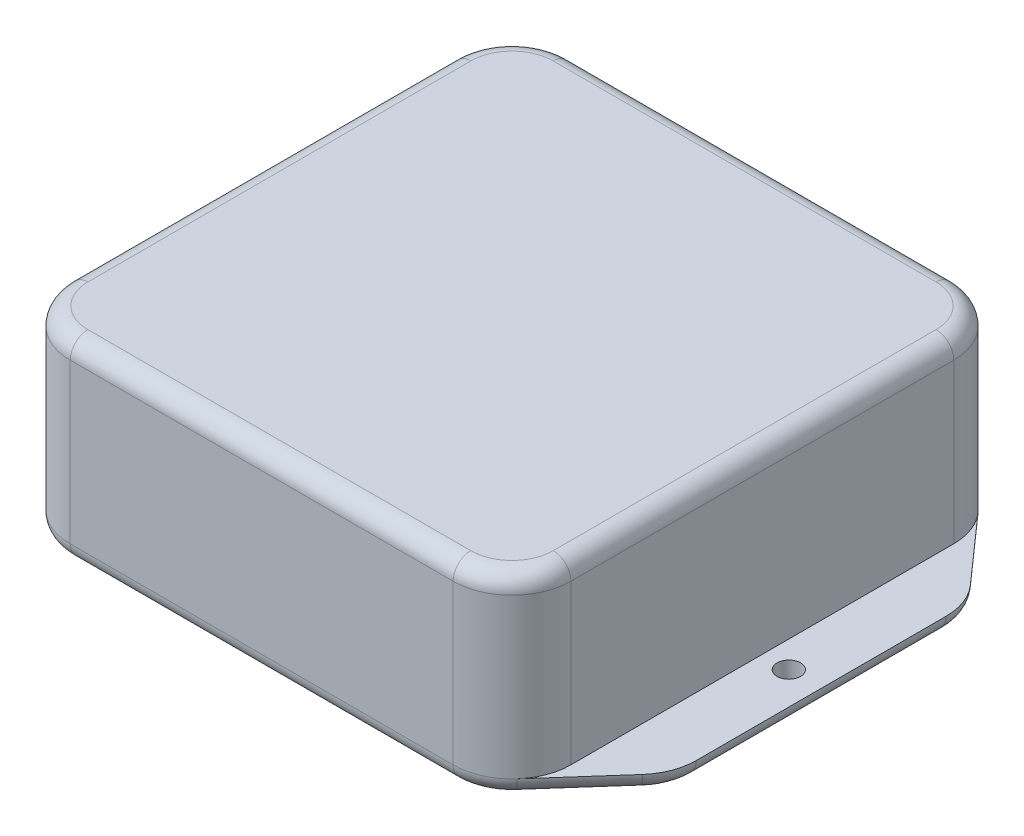
ISO-10303-21;
HEADER;
FILE_DESCRIPTION(('STEP AP214'),'2;1');
FILE_NAME('part.step','',(''),(''),'','','');
FILE_SCHEMA(('AUTOMOTIVE_DESIGN { 1 0 10303 214 1 1 1 1 }'));
ENDSEC;
DATA;
#1=APPLICATION_CONTEXT('core data for automotive mechanical design processes');
#2=APPLICATION_PROTOCOL_DEFINITION('international standard','automotive_design',2000,#1);
#3=PRODUCT_CONTEXT('',#1,'mechanical');
#4=PRODUCT('Part','Part','',(#3));
#5=PRODUCT_RELATED_PRODUCT_CATEGORY('part','',(#4));
#6=PRODUCT_DEFINITION_FORMATION('','',#4);
#7=PRODUCT_DEFINITION_CONTEXT('part definition',#1,'design');
#8=PRODUCT_DEFINITION('design','',#6,#7);
#9=PRODUCT_DEFINITION_SHAPE('','',#8);
#10=(LENGTH_UNIT() NAMED_UNIT(*) SI_UNIT(.MILLI.,.METRE.));
#11=(NAMED_UNIT(*) PLANE_ANGLE_UNIT() SI_UNIT($,.RADIAN.));
#12=(NAMED_UNIT(*) SI_UNIT($,.STERADIAN.) SOLID_ANGLE_UNIT());
#13=UNCERTAINTY_MEASURE_WITH_UNIT(LENGTH_MEASURE(1.E-05),#10,'distance_accuracy_value','');
#14=(GEOMETRIC_REPRESENTATION_CONTEXT(3) GLOBAL_UNCERTAINTY_ASSIGNED_CONTEXT((#13)) GLOBAL_UNIT_ASSIGNED_CONTEXT((#10,
#11,#12)) REPRESENTATION_CONTEXT('',''));
#15=CARTESIAN_POINT('',(0.,0.,0.));
#16=DIRECTION('',(0.,0.,1.));
#17=DIRECTION('',(1.,0.,0.));
#18=AXIS2_PLACEMENT_3D('',#15,#16,#17);
#19=CARTESIAN_POINT('',(32.5,30.,32.5));
#20=DIRECTION('',(0.,-1.,0.));
#21=DIRECTION('',(0.,0.,-1.));
#22=AXIS2_PLACEMENT_3D('',#19,#20,#21);
#23=CYLINDRICAL_SURFACE('',#22,10.);
#24=DIRECTION('',(0.,-1.,0.));
#25=VECTOR('',#24,1.);
#26=CARTESIAN_POINT('',(32.4999999999999,30.,42.5));
#27=LINE('',#26,#25);
#28=CARTESIAN_POINT('',(32.4999999999999,27.,42.5));
#29=VERTEX_POINT('',#28);
#30=CARTESIAN_POINT('',(32.4999999999999,0.,42.5));
#31=VERTEX_POINT('',#30);
#32=EDGE_CURVE('E217',#29,#31,#27,.T.);
#33=ORIENTED_EDGE('',*,*,#32,.T.);
#34=CARTESIAN_POINT('',(32.5,0.,32.5));
#35=DIRECTION('',(0.,-1.,0.));
#36=DIRECTION('',(0.,0.,-1.));
#37=AXIS2_PLACEMENT_3D('',#34,#35,#36);
#38=CIRCLE('',#37,10.);
#39=CARTESIAN_POINT('',(39.9862333295633,0.,39.1299555455022));
#40=VERTEX_POINT('',#39);
#41=EDGE_CURVE('E212',#31,#40,#38,.F.);
#42=ORIENTED_EDGE('',*,*,#41,.T.);
#43=CARTESIAN_POINT('',(32.5,0.,32.5));
#44=DIRECTION('',(0.,1.,0.));
#45=DIRECTION('',(0.,0.,1.));
#46=AXIS2_PLACEMENT_3D('',#43,#44,#45);
#47=CIRCLE('',#46,10.);
#48=CARTESIAN_POINT('',(42.5,0.,32.4999999999999));
#49=VERTEX_POINT('',#48);
#50=EDGE_CURVE('E215',#40,#49,#47,.T.);
#51=ORIENTED_EDGE('',*,*,#50,.T.);
#52=DIRECTION('',(0.,-1.,0.));
#53=VECTOR('',#52,1.);
#54=CARTESIAN_POINT('',(42.5,30.,32.4999999999999));
#55=LINE('',#54,#53);
#56=CARTESIAN_POINT('',(42.5,27.,32.4999999999999));
#57=VERTEX_POINT('',#56);
#58=EDGE_CURVE('E308',#57,#49,#55,.T.);
#59=ORIENTED_EDGE('',*,*,#58,.F.);
#60=CARTESIAN_POINT('',(32.5,27.,32.5));
#61=DIRECTION('',(0.,1.,0.));
#62=DIRECTION('',(0.,0.,1.));
#63=AXIS2_PLACEMENT_3D('',#60,#61,#62);
#64=CIRCLE('',#63,10.);
#65=EDGE_CURVE('E223',#57,#29,#64,.F.);
#66=ORIENTED_EDGE('',*,*,#65,.T.);
#67=EDGE_LOOP('',(#33,#42,#51,#59,#66));
#68=FACE_BOUND('',#67,.T.);
#69=ADVANCED_FACE('F37',(#68),#23,.T.);
#70=CARTESIAN_POINT('',(42.5,30.,32.4999999999999));
#71=DIRECTION('',(-1.,0.,0.));
#72=DIRECTION('',(0.,0.,1.));
#73=AXIS2_PLACEMENT_3D('',#70,#71,#72);
#74=PLANE('',#73);
#75=DIRECTION('',(0.,-1.,0.));
#76=VECTOR('',#75,1.);
#77=CARTESIAN_POINT('',(42.5,30.,-32.4999999999999));
#78=LINE('',#77,#76);
#79=CARTESIAN_POINT('',(42.5,27.,-32.4999999999999));
#80=VERTEX_POINT('',#79);
#81=CARTESIAN_POINT('',(42.5,0.,-32.4999999999999));
#82=VERTEX_POINT('',#81);
#83=EDGE_CURVE('E306',#80,#82,#78,.T.);
#84=ORIENTED_EDGE('',*,*,#83,.F.);
#85=DIRECTION('',(0.,0.,-1.));
#86=VECTOR('',#85,1.);
#87=CARTESIAN_POINT('',(42.5,27.,32.4999999999999));
#88=LINE('',#87,#86);
#89=EDGE_CURVE('E11',#80,#57,#88,.F.);
#90=ORIENTED_EDGE('',*,*,#89,.T.);
#91=ORIENTED_EDGE('',*,*,#58,.T.);
#92=DIRECTION('',(0.,0.,-1.));
#93=VECTOR('',#92,1.);
#94=CARTESIAN_POINT('',(42.5,0.,32.4999999999999));
#95=LINE('',#94,#93);
#96=EDGE_CURVE('E234',#49,#82,#95,.T.);
#97=ORIENTED_EDGE('',*,*,#96,.T.);
#98=EDGE_LOOP('',(#84,#90,#91,#97));
#99=FACE_BOUND('',#98,.T.);
#100=ADVANCED_FACE('F450',(#99),#74,.F.);
#101=CARTESIAN_POINT('',(32.5,30.,-32.5));
#102=DIRECTION('',(0.,-1.,0.));
#103=DIRECTION('',(0.,0.,-1.));
#104=AXIS2_PLACEMENT_3D('',#101,#102,#103);
#105=CYLINDRICAL_SURFACE('',#104,10.);
#106=CARTESIAN_POINT('',(32.5,0.,-32.5));
#107=DIRECTION('',(0.,1.,0.));
#108=DIRECTION('',(0.,0.,-1.));
#109=AXIS2_PLACEMENT_3D('',#106,#107,#108);
#110=CIRCLE('',#109,10.);
#111=CARTESIAN_POINT('',(39.9862333295633,0.,-39.1299555455022));
#112=VERTEX_POINT('',#111);
#113=EDGE_CURVE('E280',#82,#112,#110,.T.);
#114=ORIENTED_EDGE('',*,*,#113,.T.);
#115=CARTESIAN_POINT('',(32.5,0.,-32.5));
#116=DIRECTION('',(0.,-1.,0.));
#117=DIRECTION('',(0.,0.,-1.));
#118=AXIS2_PLACEMENT_3D('',#115,#116,#117);
#119=CIRCLE('',#118,10.);
#120=CARTESIAN_POINT('',(32.4999999999999,0.,-42.5));
#121=VERTEX_POINT('',#120);
#122=EDGE_CURVE('E344',#112,#121,#119,.F.);
#123=ORIENTED_EDGE('',*,*,#122,.T.);
#124=DIRECTION('',(0.,-1.,0.));
#125=VECTOR('',#124,1.);
#126=CARTESIAN_POINT('',(32.4999999999999,30.,-42.5));
#127=LINE('',#126,#125);
#128=CARTESIAN_POINT('',(32.4999999999999,27.,-42.5));
#129=VERTEX_POINT('',#128);
#130=EDGE_CURVE('E303',#129,#121,#127,.T.);
#131=ORIENTED_EDGE('',*,*,#130,.F.);
#132=CARTESIAN_POINT('',(32.5,27.,-32.5));
#133=DIRECTION('',(0.,1.,0.));
#134=DIRECTION('',(0.,0.,1.));
#135=AXIS2_PLACEMENT_3D('',#132,#133,#134);
#136=CIRCLE('',#135,10.);
#137=EDGE_CURVE('E342',#129,#80,#136,.F.);
#138=ORIENTED_EDGE('',*,*,#137,.T.);
#139=ORIENTED_EDGE('',*,*,#83,.T.);
#140=EDGE_LOOP('',(#114,#123,#131,#138,#139));
#141=FACE_BOUND('',#140,.T.);
#142=ADVANCED_FACE('F448',(#141),#105,.T.);
#143=CARTESIAN_POINT('',(-32.4999999999999,30.,-42.5));
#144=DIRECTION('',(0.,0.,1.));
#145=DIRECTION('',(1.,0.,0.));
#146=AXIS2_PLACEMENT_3D('',#143,#144,#145);
#147=PLANE('',#146);
#148=ORIENTED_EDGE('',*,*,#130,.T.);
#149=DIRECTION('',(1.,0.,0.));
#150=VECTOR('',#149,1.);
#151=CARTESIAN_POINT('',(-32.5,0.,-42.5));
#152=LINE('',#151,#150);
#153=CARTESIAN_POINT('',(-32.5,0.,-42.5));
#154=VERTEX_POINT('',#153);
#155=EDGE_CURVE('E348',#121,#154,#152,.F.);
#156=ORIENTED_EDGE('',*,*,#155,.T.);
#157=DIRECTION('',(0.,-1.,0.));
#158=VECTOR('',#157,1.);
#159=CARTESIAN_POINT('',(-32.5,30.,-42.5));
#160=LINE('',#159,#158);
#161=CARTESIAN_POINT('',(-32.5,27.,-42.5));
#162=VERTEX_POINT('',#161);
#163=EDGE_CURVE('E300',#162,#154,#160,.T.);
#164=ORIENTED_EDGE('',*,*,#163,.F.);
#165=DIRECTION('',(-1.,0.,0.));
#166=VECTOR('',#165,1.);
#167=CARTESIAN_POINT('',(32.4999999999999,27.,-42.5));
#168=LINE('',#167,#166);
#169=EDGE_CURVE('E346',#162,#129,#168,.F.);
#170=ORIENTED_EDGE('',*,*,#169,.T.);
#171=EDGE_LOOP('',(#148,#156,#164,#170));
#172=FACE_BOUND('',#171,.T.);
#173=ADVANCED_FACE('F790',(#172),#147,.F.);
#174=CARTESIAN_POINT('',(-32.5,30.,-32.5));
#175=DIRECTION('',(0.,-1.,0.));
#176=DIRECTION('',(0.,0.,-1.));
#177=AXIS2_PLACEMENT_3D('',#174,#175,#176);
#178=CYLINDRICAL_SURFACE('',#177,10.);
#179=ORIENTED_EDGE('',*,*,#163,.T.);
#180=CARTESIAN_POINT('',(-32.5,0.,-32.5));
#181=DIRECTION('',(0.,-1.,0.));
#182=DIRECTION('',(0.,0.,-1.));
#183=AXIS2_PLACEMENT_3D('',#180,#181,#182);
#184=CIRCLE('',#183,10.);
#185=CARTESIAN_POINT('',(-39.9862333295633,0.,-39.1299555455022));
#186=VERTEX_POINT('',#185);
#187=EDGE_CURVE('E352',#154,#186,#184,.F.);
#188=ORIENTED_EDGE('',*,*,#187,.T.);
#189=CARTESIAN_POINT('',(-32.5,0.,-32.5));
#190=DIRECTION('',(0.,1.,0.));
#191=DIRECTION('',(0.,0.,-1.));
#192=AXIS2_PLACEMENT_3D('',#189,#190,#191);
#193=CIRCLE('',#192,10.);
#194=CARTESIAN_POINT('',(-42.5,0.,-32.4999999999999));
#195=VERTEX_POINT('',#194);
#196=EDGE_CURVE('E283',#186,#195,#193,.T.);
#197=ORIENTED_EDGE('',*,*,#196,.T.);
#198=DIRECTION('',(0.,-1.,0.));
#199=VECTOR('',#198,1.);
#200=CARTESIAN_POINT('',(-42.5,30.,-32.4999999999999));
#201=LINE('',#200,#199);
#202=CARTESIAN_POINT('',(-42.5,27.,-32.4999999999999));
#203=VERTEX_POINT('',#202);
#204=EDGE_CURVE('E298',#203,#195,#201,.T.);
#205=ORIENTED_EDGE('',*,*,#204,.F.);
#206=CARTESIAN_POINT('',(-32.5,27.,-32.5));
#207=DIRECTION('',(0.,1.,0.));
#208=DIRECTION('',(0.,0.,1.));
#209=AXIS2_PLACEMENT_3D('',#206,#207,#208);
#210=CIRCLE('',#209,10.);
#211=EDGE_CURVE('E350',#203,#162,#210,.F.);
#212=ORIENTED_EDGE('',*,*,#211,.T.);
#213=EDGE_LOOP('',(#179,#188,#197,#205,#212));
#214=FACE_BOUND('',#213,.T.);
#215=ADVANCED_FACE('F484',(#214),#178,.T.);
#216=CARTESIAN_POINT('',(-42.5,30.,32.4999999999999));
#217=DIRECTION('',(1.,0.,0.));
#218=DIRECTION('',(0.,0.,-1.));
#219=AXIS2_PLACEMENT_3D('',#216,#217,#218);
#220=PLANE('',#219);
#221=DIRECTION('',(0.,-1.,0.));
#222=VECTOR('',#221,1.);
#223=CARTESIAN_POINT('',(-42.5,30.,32.4999999999999));
#224=LINE('',#223,#222);
#225=CARTESIAN_POINT('',(-42.5,27.,32.4999999999999));
#226=VERTEX_POINT('',#225);
#227=CARTESIAN_POINT('',(-42.5,0.,32.4999999999999));
#228=VERTEX_POINT('',#227);
#229=EDGE_CURVE('E296',#226,#228,#224,.T.);
#230=ORIENTED_EDGE('',*,*,#229,.F.);
#231=DIRECTION('',(0.,0.,1.));
#232=VECTOR('',#231,1.);
#233=CARTESIAN_POINT('',(-42.5,27.,-32.4999999999999));
#234=LINE('',#233,#232);
#235=EDGE_CURVE('E46',#226,#203,#234,.F.);
#236=ORIENTED_EDGE('',*,*,#235,.T.);
#237=ORIENTED_EDGE('',*,*,#204,.T.);
#238=DIRECTION('',(0.,0.,1.));
#239=VECTOR('',#238,1.);
#240=CARTESIAN_POINT('',(-42.5,0.,32.4999999999999));
#241=LINE('',#240,#239);
#242=EDGE_CURVE('E286',#195,#228,#241,.T.);
#243=ORIENTED_EDGE('',*,*,#242,.T.);
#244=EDGE_LOOP('',(#230,#236,#237,#243));
#245=FACE_BOUND('',#244,.T.);
#246=ADVANCED_FACE('F480',(#245),#220,.F.);
#247=CARTESIAN_POINT('',(-32.5,30.,32.5));
#248=DIRECTION('',(0.,-1.,0.));
#249=DIRECTION('',(0.,0.,-1.));
#250=AXIS2_PLACEMENT_3D('',#247,#248,#249);
#251=CYLINDRICAL_SURFACE('',#250,10.);
#252=CARTESIAN_POINT('',(-32.5,0.,32.5));
#253=DIRECTION('',(0.,1.,0.));
#254=DIRECTION('',(0.,0.,-1.));
#255=AXIS2_PLACEMENT_3D('',#252,#253,#254);
#256=CIRCLE('',#255,10.);
#257=CARTESIAN_POINT('',(-39.9862333295633,0.,39.1299555455022));
#258=VERTEX_POINT('',#257);
#259=EDGE_CURVE('E289',#228,#258,#256,.T.);
#260=ORIENTED_EDGE('',*,*,#259,.T.);
#261=CARTESIAN_POINT('',(-32.5,0.,32.5));
#262=DIRECTION('',(0.,-1.,0.));
#263=DIRECTION('',(0.,0.,-1.));
#264=AXIS2_PLACEMENT_3D('',#261,#262,#263);
#265=CIRCLE('',#264,10.);
#266=CARTESIAN_POINT('',(-32.4999999999999,0.,42.5));
#267=VERTEX_POINT('',#266);
#268=EDGE_CURVE('E357',#258,#267,#265,.F.);
#269=ORIENTED_EDGE('',*,*,#268,.T.);
#270=DIRECTION('',(0.,-1.,0.));
#271=VECTOR('',#270,1.);
#272=CARTESIAN_POINT('',(-32.4999999999999,30.,42.5));
#273=LINE('',#272,#271);
#274=CARTESIAN_POINT('',(-32.4999999999999,27.,42.5));
#275=VERTEX_POINT('',#274);
#276=EDGE_CURVE('E293',#275,#267,#273,.T.);
#277=ORIENTED_EDGE('',*,*,#276,.F.);
#278=CARTESIAN_POINT('',(-32.5,27.,32.5));
#279=DIRECTION('',(0.,1.,0.));
#280=DIRECTION('',(0.,0.,1.));
#281=AXIS2_PLACEMENT_3D('',#278,#279,#280);
#282=CIRCLE('',#281,10.);
#283=EDGE_CURVE('E354',#275,#226,#282,.F.);
#284=ORIENTED_EDGE('',*,*,#283,.T.);
#285=ORIENTED_EDGE('',*,*,#229,.T.);
#286=EDGE_LOOP('',(#260,#269,#277,#284,#285));
#287=FACE_BOUND('',#286,.T.);
#288=ADVANCED_FACE('F469',(#287),#251,.T.);
#289=CARTESIAN_POINT('',(-32.4999999999999,30.,42.5));
#290=DIRECTION('',(0.,0.,-1.));
#291=DIRECTION('',(-1.,0.,0.));
#292=AXIS2_PLACEMENT_3D('',#289,#290,#291);
#293=PLANE('',#292);
#294=ORIENTED_EDGE('',*,*,#276,.T.);
#295=DIRECTION('',(-1.,0.,0.));
#296=VECTOR('',#295,1.);
#297=CARTESIAN_POINT('',(32.4999999999999,0.,42.5));
#298=LINE('',#297,#296);
#299=EDGE_CURVE('E361',#267,#31,#298,.F.);
#300=ORIENTED_EDGE('',*,*,#299,.T.);
#301=ORIENTED_EDGE('',*,*,#32,.F.);
#302=DIRECTION('',(1.,0.,0.));
#303=VECTOR('',#302,1.);
#304=CARTESIAN_POINT('',(-32.4999999999999,27.,42.5));
#305=LINE('',#304,#303);
#306=EDGE_CURVE('E359',#29,#275,#305,.F.);
#307=ORIENTED_EDGE('',*,*,#306,.T.);
#308=EDGE_LOOP('',(#294,#300,#301,#307));
#309=FACE_BOUND('',#308,.T.);
#310=ADVANCED_FACE('F465',(#309),#293,.F.);
#311=CARTESIAN_POINT('',(32.5,30.,32.5));
#312=DIRECTION('',(0.,1.,0.));
#313=DIRECTION('',(0.,0.,1.));
#314=AXIS2_PLACEMENT_3D('',#311,#312,#313);
#315=PLANE('',#314);
#316=DIRECTION('',(0.,0.,1.));
#317=VECTOR('',#316,1.);
#318=CARTESIAN_POINT('',(-39.5,30.,32.4999999999999));
#319=LINE('',#318,#317);
#320=CARTESIAN_POINT('',(-39.5,30.,-32.4999999999999));
#321=VERTEX_POINT('',#320);
#322=CARTESIAN_POINT('',(-39.5,30.,32.5));
#323=VERTEX_POINT('',#322);
#324=EDGE_CURVE('E54',#321,#323,#319,.T.);
#325=ORIENTED_EDGE('',*,*,#324,.T.);
#326=CARTESIAN_POINT('',(-32.5,30.,32.5));
#327=DIRECTION('',(0.,1.,0.));
#328=DIRECTION('',(0.,0.,1.));
#329=AXIS2_PLACEMENT_3D('',#326,#327,#328);
#330=CIRCLE('',#329,7.);
#331=CARTESIAN_POINT('',(-32.5,30.,39.5));
#332=VERTEX_POINT('',#331);
#333=EDGE_CURVE('E375',#323,#332,#330,.T.);
#334=ORIENTED_EDGE('',*,*,#333,.T.);
#335=DIRECTION('',(1.,0.,0.));
#336=VECTOR('',#335,1.);
#337=CARTESIAN_POINT('',(32.4999999999999,30.,39.5));
#338=LINE('',#337,#336);
#339=CARTESIAN_POINT('',(32.4999999999999,30.,39.5));
#340=VERTEX_POINT('',#339);
#341=EDGE_CURVE('E222',#332,#340,#338,.T.);
#342=ORIENTED_EDGE('',*,*,#341,.T.);
#343=CARTESIAN_POINT('',(32.5,30.,32.5));
#344=DIRECTION('',(0.,1.,0.));
#345=DIRECTION('',(0.,0.,1.));
#346=AXIS2_PLACEMENT_3D('',#343,#344,#345);
#347=CIRCLE('',#346,7.);
#348=CARTESIAN_POINT('',(39.5,30.,32.4999999999999));
#349=VERTEX_POINT('',#348);
#350=EDGE_CURVE('E365',#340,#349,#347,.T.);
#351=ORIENTED_EDGE('',*,*,#350,.T.);
#352=DIRECTION('',(0.,0.,-1.));
#353=VECTOR('',#352,1.);
#354=CARTESIAN_POINT('',(39.5,30.,-32.4999999999999));
#355=LINE('',#354,#353);
#356=CARTESIAN_POINT('',(39.5,30.,-32.4999999999999));
#357=VERTEX_POINT('',#356);
#358=EDGE_CURVE('E367',#349,#357,#355,.T.);
#359=ORIENTED_EDGE('',*,*,#358,.T.);
#360=CARTESIAN_POINT('',(32.5,30.,-32.5));
#361=DIRECTION('',(0.,1.,0.));
#362=DIRECTION('',(0.,0.,1.));
#363=AXIS2_PLACEMENT_3D('',#360,#361,#362);
#364=CIRCLE('',#363,7.);
#365=CARTESIAN_POINT('',(32.4999999999999,30.,-39.5));
#366=VERTEX_POINT('',#365);
#367=EDGE_CURVE('E369',#357,#366,#364,.T.);
#368=ORIENTED_EDGE('',*,*,#367,.T.);
#369=DIRECTION('',(-1.,0.,0.));
#370=VECTOR('',#369,1.);
#371=CARTESIAN_POINT('',(-32.5,30.,-39.5));
#372=LINE('',#371,#370);
#373=CARTESIAN_POINT('',(-32.5,30.,-39.5));
#374=VERTEX_POINT('',#373);
#375=EDGE_CURVE('E371',#366,#374,#372,.T.);
#376=ORIENTED_EDGE('',*,*,#375,.T.);
#377=CARTESIAN_POINT('',(-32.5,30.,-32.5));
#378=DIRECTION('',(0.,1.,0.));
#379=DIRECTION('',(0.,0.,1.));
#380=AXIS2_PLACEMENT_3D('',#377,#378,#379);
#381=CIRCLE('',#380,7.);
#382=EDGE_CURVE('E59',#374,#321,#381,.T.);
#383=ORIENTED_EDGE('',*,*,#382,.T.);
#384=EDGE_LOOP('',(#325,#334,#342,#351,#359,#368,#376,#383));
#385=FACE_BOUND('',#384,.T.);
#386=ADVANCED_FACE('F756',(#385),#315,.T.);
#387=CARTESIAN_POINT('',(0.,0.,0.));
#388=DIRECTION('',(0.,-1.,0.));
#389=DIRECTION('',(0.,0.,-1.));
#390=AXIS2_PLACEMENT_3D('',#387,#388,#389);
#391=PLANE('',#390);
#392=CARTESIAN_POINT('',(-47.,0.,0.));
#393=DIRECTION('',(0.,1.,0.));
#394=DIRECTION('',(0.,0.,1.));
#395=AXIS2_PLACEMENT_3D('',#392,#393,#394);
#396=CIRCLE('',#395,2.);
#397=CARTESIAN_POINT('',(-47.,0.,2.));
#398=VERTEX_POINT('',#397);
#399=EDGE_CURVE('E943',#398,#398,#396,.T.);
#400=ORIENTED_EDGE('',*,*,#399,.F.);
#401=EDGE_LOOP('',(#400));
#402=FACE_BOUND('',#401,.T.);
#403=ORIENTED_EDGE('',*,*,#259,.F.);
#404=ORIENTED_EDGE('',*,*,#242,.F.);
#405=ORIENTED_EDGE('',*,*,#196,.F.);
#406=DIRECTION('',(0.66299555455022,0.,-0.748623332956332));
#407=VECTOR('',#406,1.);
#408=CARTESIAN_POINT('',(-41.8312855135144,0.,-37.0466095774213));
#409=LINE('',#408,#407);
#410=CARTESIAN_POINT('',(-49.9862333295634,0.,-27.8384268494432));
#411=VERTEX_POINT('',#410);
#412=EDGE_CURVE('E269',#411,#186,#409,.T.);
#413=ORIENTED_EDGE('',*,*,#412,.F.);
#414=CARTESIAN_POINT('',(-42.5,0.,-21.208471303941));
#415=DIRECTION('',(0.,-1.,0.));
#416=DIRECTION('',(0.,0.,-1.));
#417=AXIS2_PLACEMENT_3D('',#414,#415,#416);
#418=CIRCLE('',#417,10.);
#419=CARTESIAN_POINT('',(-52.5,0.,-21.208471303941));
#420=VERTEX_POINT('',#419);
#421=EDGE_CURVE('E266',#420,#411,#418,.T.);
#422=ORIENTED_EDGE('',*,*,#421,.F.);
#423=DIRECTION('',(0.,0.,-1.));
#424=VECTOR('',#423,1.);
#425=CARTESIAN_POINT('',(-52.5,0.,0.));
#426=LINE('',#425,#424);
#427=CARTESIAN_POINT('',(-52.5,0.,21.208471303941));
#428=VERTEX_POINT('',#427);
#429=EDGE_CURVE('E263',#428,#420,#426,.T.);
#430=ORIENTED_EDGE('',*,*,#429,.F.);
#431=CARTESIAN_POINT('',(-42.5,0.,21.208471303941));
#432=DIRECTION('',(0.,-1.,0.));
#433=DIRECTION('',(0.,0.,-1.));
#434=AXIS2_PLACEMENT_3D('',#431,#432,#433);
#435=CIRCLE('',#434,10.);
#436=CARTESIAN_POINT('',(-49.9862333295633,0.,27.8384268494432));
#437=VERTEX_POINT('',#436);
#438=EDGE_CURVE('E253',#428,#437,#435,.F.);
#439=ORIENTED_EDGE('',*,*,#438,.T.);
#440=DIRECTION('',(0.662995554550219,0.,0.748623332956333));
#441=VECTOR('',#440,1.);
#442=CARTESIAN_POINT('',(-41.8312855135144,0.,37.0466095774212));
#443=LINE('',#442,#441);
#444=EDGE_CURVE('E250',#437,#258,#443,.T.);
#445=ORIENTED_EDGE('',*,*,#444,.T.);
#446=EDGE_LOOP('',(#403,#404,#405,#413,#422,#430,#439,#445));
#447=FACE_BOUND('',#446,.T.);
#448=ADVANCED_FACE('F737',(#402,#447),#391,.F.);
#449=CARTESIAN_POINT('',(0.,-3.,0.));
#450=DIRECTION('',(0.,-1.,0.));
#451=DIRECTION('',(0.,0.,-1.));
#452=AXIS2_PLACEMENT_3D('',#449,#450,#451);
#453=PLANE('',#452);
#454=CARTESIAN_POINT('',(-47.,-3.,0.));
#455=DIRECTION('',(0.,1.,0.));
#456=DIRECTION('',(0.,0.,1.));
#457=AXIS2_PLACEMENT_3D('',#454,#455,#456);
#458=CIRCLE('',#457,2.);
#459=CARTESIAN_POINT('',(-47.,-3.,2.));
#460=VERTEX_POINT('',#459);
#461=EDGE_CURVE('E416',#460,#460,#458,.T.);
#462=ORIENTED_EDGE('',*,*,#461,.T.);
#463=EDGE_LOOP('',(#462));
#464=FACE_BOUND('',#463,.T.);
#465=CARTESIAN_POINT('',(47.,-3.,0.));
#466=DIRECTION('',(0.,1.,0.));
#467=DIRECTION('',(0.,0.,-1.));
#468=AXIS2_PLACEMENT_3D('',#465,#466,#467);
#469=CIRCLE('',#468,2.);
#470=CARTESIAN_POINT('',(47.,-3.,-2.));
#471=VERTEX_POINT('',#470);
#472=EDGE_CURVE('E945',#471,#471,#469,.T.);
#473=ORIENTED_EDGE('',*,*,#472,.T.);
#474=EDGE_LOOP('',(#473));
#475=FACE_BOUND('',#474,.T.);
#476=DIRECTION('',(0.,0.,-1.));
#477=VECTOR('',#476,1.);
#478=CARTESIAN_POINT('',(49.5,-3.,0.));
#479=LINE('',#478,#477);
#480=CARTESIAN_POINT('',(49.5,-3.,-21.208471303941));
#481=VERTEX_POINT('',#480);
#482=CARTESIAN_POINT('',(49.5,-3.,21.208471303941));
#483=VERTEX_POINT('',#482);
#484=EDGE_CURVE('E337',#481,#483,#479,.F.);
#485=ORIENTED_EDGE('',*,*,#484,.T.);
#486=CARTESIAN_POINT('',(42.5,-3.,21.208471303941));
#487=DIRECTION('',(0.,-1.,0.));
#488=DIRECTION('',(0.,0.,-1.));
#489=AXIS2_PLACEMENT_3D('',#486,#487,#488);
#490=CIRCLE('',#489,7.);
#491=CARTESIAN_POINT('',(47.7403633306944,-3.,25.8494401857926));
#492=VERTEX_POINT('',#491);
#493=EDGE_CURVE('E339',#483,#492,#490,.T.);
#494=ORIENTED_EDGE('',*,*,#493,.T.);
#495=DIRECTION('',(-0.662995554550219,0.,0.748623332956333));
#496=VECTOR('',#495,1.);
#497=CARTESIAN_POINT('',(37.7403633306943,-3.,37.1409688818516));
#498=LINE('',#497,#496);
#499=CARTESIAN_POINT('',(37.7403633306943,-3.,37.1409688818516));
#500=VERTEX_POINT('',#499);
#501=EDGE_CURVE('E310',#492,#500,#498,.T.);
#502=ORIENTED_EDGE('',*,*,#501,.T.);
#503=CARTESIAN_POINT('',(32.5,-3.,32.5));
#504=DIRECTION('',(0.,-1.,0.));
#505=DIRECTION('',(0.,0.,-1.));
#506=AXIS2_PLACEMENT_3D('',#503,#504,#505);
#507=CIRCLE('',#506,7.);
#508=CARTESIAN_POINT('',(32.4999999999999,-3.,39.5));
#509=VERTEX_POINT('',#508);
#510=EDGE_CURVE('E241',#500,#509,#507,.T.);
#511=ORIENTED_EDGE('',*,*,#510,.T.);
#512=DIRECTION('',(-1.,0.,0.));
#513=VECTOR('',#512,1.);
#514=CARTESIAN_POINT('',(-32.4999999999999,-3.,39.5));
#515=LINE('',#514,#513);
#516=CARTESIAN_POINT('',(-32.5,-3.,39.5));
#517=VERTEX_POINT('',#516);
#518=EDGE_CURVE('E313',#509,#517,#515,.T.);
#519=ORIENTED_EDGE('',*,*,#518,.T.);
#520=CARTESIAN_POINT('',(-32.5,-3.,32.5));
#521=DIRECTION('',(0.,-1.,0.));
#522=DIRECTION('',(0.,0.,-1.));
#523=AXIS2_PLACEMENT_3D('',#520,#521,#522);
#524=CIRCLE('',#523,7.);
#525=CARTESIAN_POINT('',(-37.7403633306943,-3.,37.1409688818515));
#526=VERTEX_POINT('',#525);
#527=EDGE_CURVE('E315',#517,#526,#524,.T.);
#528=ORIENTED_EDGE('',*,*,#527,.T.);
#529=DIRECTION('',(0.662995554550219,0.,0.748623332956333));
#530=VECTOR('',#529,1.);
#531=CARTESIAN_POINT('',(-39.5854155146454,-3.,35.0576229137705));
#532=LINE('',#531,#530);
#533=CARTESIAN_POINT('',(-47.7403633306943,-3.,25.8494401857926));
#534=VERTEX_POINT('',#533);
#535=EDGE_CURVE('E317',#526,#534,#532,.F.);
#536=ORIENTED_EDGE('',*,*,#535,.T.);
#537=CARTESIAN_POINT('',(-42.5,-3.,21.208471303941));
#538=DIRECTION('',(0.,-1.,0.));
#539=DIRECTION('',(0.,0.,-1.));
#540=AXIS2_PLACEMENT_3D('',#537,#538,#539);
#541=CIRCLE('',#540,7.);
#542=CARTESIAN_POINT('',(-49.5,-3.,21.208471303941));
#543=VERTEX_POINT('',#542);
#544=EDGE_CURVE('E319',#534,#543,#541,.T.);
#545=ORIENTED_EDGE('',*,*,#544,.T.);
#546=DIRECTION('',(0.,0.,-1.));
#547=VECTOR('',#546,1.);
#548=CARTESIAN_POINT('',(-49.5,-3.,-21.208471303941));
#549=LINE('',#548,#547);
#550=CARTESIAN_POINT('',(-49.5,-3.,-21.208471303941));
#551=VERTEX_POINT('',#550);
#552=EDGE_CURVE('E321',#543,#551,#549,.T.);
#553=ORIENTED_EDGE('',*,*,#552,.T.);
#554=CARTESIAN_POINT('',(-42.5,-3.,-21.208471303941));
#555=DIRECTION('',(0.,-1.,0.));
#556=DIRECTION('',(0.,0.,-1.));
#557=AXIS2_PLACEMENT_3D('',#554,#555,#556);
#558=CIRCLE('',#557,7.00000000000001);
#559=CARTESIAN_POINT('',(-47.7403633306944,-3.,-25.8494401857926));
#560=VERTEX_POINT('',#559);
#561=EDGE_CURVE('E323',#551,#560,#558,.T.);
#562=ORIENTED_EDGE('',*,*,#561,.T.);
#563=DIRECTION('',(0.66299555455022,0.,-0.748623332956332));
#564=VECTOR('',#563,1.);
#565=CARTESIAN_POINT('',(-37.7403633306943,-3.,-37.1409688818515));
#566=LINE('',#565,#564);
#567=CARTESIAN_POINT('',(-37.7403633306943,-3.,-37.1409688818515));
#568=VERTEX_POINT('',#567);
#569=EDGE_CURVE('E325',#560,#568,#566,.T.);
#570=ORIENTED_EDGE('',*,*,#569,.T.);
#571=CARTESIAN_POINT('',(-32.5,-3.,-32.5));
#572=DIRECTION('',(0.,-1.,0.));
#573=DIRECTION('',(0.,0.,-1.));
#574=AXIS2_PLACEMENT_3D('',#571,#572,#573);
#575=CIRCLE('',#574,7.);
#576=CARTESIAN_POINT('',(-32.5,-3.,-39.5));
#577=VERTEX_POINT('',#576);
#578=EDGE_CURVE('E327',#568,#577,#575,.T.);
#579=ORIENTED_EDGE('',*,*,#578,.T.);
#580=DIRECTION('',(1.,0.,0.));
#581=VECTOR('',#580,1.);
#582=CARTESIAN_POINT('',(32.5,-3.,-39.5));
#583=LINE('',#582,#581);
#584=CARTESIAN_POINT('',(32.4999999999999,-3.,-39.5));
#585=VERTEX_POINT('',#584);
#586=EDGE_CURVE('E329',#577,#585,#583,.T.);
#587=ORIENTED_EDGE('',*,*,#586,.T.);
#588=CARTESIAN_POINT('',(32.5,-3.,-32.5));
#589=DIRECTION('',(0.,-1.,0.));
#590=DIRECTION('',(0.,0.,-1.));
#591=AXIS2_PLACEMENT_3D('',#588,#589,#590);
#592=CIRCLE('',#591,7.);
#593=CARTESIAN_POINT('',(37.7403633306943,-3.,-37.1409688818515));
#594=VERTEX_POINT('',#593);
#595=EDGE_CURVE('E331',#585,#594,#592,.T.);
#596=ORIENTED_EDGE('',*,*,#595,.T.);
#597=DIRECTION('',(-0.66299555455022,0.,-0.748623332956332));
#598=VECTOR('',#597,1.);
#599=CARTESIAN_POINT('',(39.5854155146454,-3.,-35.0576229137706));
#600=LINE('',#599,#598);
#601=CARTESIAN_POINT('',(47.7403633306944,-3.,-25.8494401857926));
#602=VERTEX_POINT('',#601);
#603=EDGE_CURVE('E333',#594,#602,#600,.F.);
#604=ORIENTED_EDGE('',*,*,#603,.T.);
#605=CARTESIAN_POINT('',(42.5,-3.,-21.208471303941));
#606=DIRECTION('',(0.,-1.,0.));
#607=DIRECTION('',(0.,0.,-1.));
#608=AXIS2_PLACEMENT_3D('',#605,#606,#607);
#609=CIRCLE('',#608,7.00000000000001);
#610=EDGE_CURVE('E335',#602,#481,#609,.T.);
#611=ORIENTED_EDGE('',*,*,#610,.T.);
#612=EDGE_LOOP('',(#485,#494,#502,#511,#519,#528,#536,#545,#553,#562,#570,#579,#587,#596,#604,#611));
#613=FACE_BOUND('',#612,.T.);
#614=ADVANCED_FACE('F734',(#464,#475,#613),#453,.T.);
#615=CARTESIAN_POINT('',(47.,0.,0.));
#616=DIRECTION('',(0.,1.,0.));
#617=DIRECTION('',(0.,0.,-1.));
#618=AXIS2_PLACEMENT_3D('',#615,#616,#617);
#619=CIRCLE('',#618,2.);
#620=CARTESIAN_POINT('',(47.,0.,-2.));
#621=VERTEX_POINT('',#620);
#622=EDGE_CURVE('E259',#621,#621,#619,.T.);
#623=ORIENTED_EDGE('',*,*,#622,.F.);
#624=EDGE_LOOP('',(#623));
#625=FACE_BOUND('',#624,.T.);
#626=ORIENTED_EDGE('',*,*,#50,.F.);
#627=DIRECTION('',(-0.662995554550219,0.,0.748623332956333));
#628=VECTOR('',#627,1.);
#629=CARTESIAN_POINT('',(41.8312855135144,0.,37.0466095774212));
#630=LINE('',#629,#628);
#631=CARTESIAN_POINT('',(49.9862333295633,0.,27.8384268494432));
#632=VERTEX_POINT('',#631);
#633=EDGE_CURVE('E230',#632,#40,#630,.T.);
#634=ORIENTED_EDGE('',*,*,#633,.F.);
#635=CARTESIAN_POINT('',(42.5,0.,21.208471303941));
#636=DIRECTION('',(0.,-1.,0.));
#637=DIRECTION('',(0.,0.,-1.));
#638=AXIS2_PLACEMENT_3D('',#635,#636,#637);
#639=CIRCLE('',#638,10.);
#640=CARTESIAN_POINT('',(52.5,0.,21.208471303941));
#641=VERTEX_POINT('',#640);
#642=EDGE_CURVE('E235',#641,#632,#639,.T.);
#643=ORIENTED_EDGE('',*,*,#642,.F.);
#644=DIRECTION('',(0.,0.,-1.));
#645=VECTOR('',#644,1.);
#646=CARTESIAN_POINT('',(52.5,0.,0.));
#647=LINE('',#646,#645);
#648=CARTESIAN_POINT('',(52.5,0.,-21.208471303941));
#649=VERTEX_POINT('',#648);
#650=EDGE_CURVE('E276',#641,#649,#647,.T.);
#651=ORIENTED_EDGE('',*,*,#650,.T.);
#652=CARTESIAN_POINT('',(42.5,0.,-21.208471303941));
#653=DIRECTION('',(0.,-1.,0.));
#654=DIRECTION('',(0.,0.,-1.));
#655=AXIS2_PLACEMENT_3D('',#652,#653,#654);
#656=CIRCLE('',#655,10.);
#657=CARTESIAN_POINT('',(49.9862333295634,0.,-27.8384268494432));
#658=VERTEX_POINT('',#657);
#659=EDGE_CURVE('E274',#649,#658,#656,.F.);
#660=ORIENTED_EDGE('',*,*,#659,.T.);
#661=DIRECTION('',(-0.66299555455022,0.,-0.748623332956332));
#662=VECTOR('',#661,1.);
#663=CARTESIAN_POINT('',(41.8312855135144,0.,-37.0466095774213));
#664=LINE('',#663,#662);
#665=EDGE_CURVE('E272',#658,#112,#664,.T.);
#666=ORIENTED_EDGE('',*,*,#665,.T.);
#667=ORIENTED_EDGE('',*,*,#113,.F.);
#668=ORIENTED_EDGE('',*,*,#96,.F.);
#669=EDGE_LOOP('',(#626,#634,#643,#651,#660,#666,#667,#668));
#670=FACE_BOUND('',#669,.T.);
#671=ADVANCED_FACE('F227',(#625,#670),#391,.F.);
#672=CARTESIAN_POINT('',(-42.5,0.,-21.208471303941));
#673=DIRECTION('',(0.,-1.,0.));
#674=DIRECTION('',(0.,0.,-1.));
#675=AXIS2_PLACEMENT_3D('',#672,#673,#674);
#676=TOROIDAL_SURFACE('',#675,7.00000000000001,3.);
#677=CARTESIAN_POINT('',(-49.5,0.,-21.208471303941));
#678=DIRECTION('',(0.,0.,1.));
#679=DIRECTION('',(1.,0.,0.));
#680=AXIS2_PLACEMENT_3D('',#677,#678,#679);
#681=CIRCLE('',#680,3.);
#682=EDGE_CURVE('E256',#420,#551,#681,.T.);
#683=ORIENTED_EDGE('',*,*,#682,.F.);
#684=ORIENTED_EDGE('',*,*,#421,.T.);
#685=CARTESIAN_POINT('',(-47.7403633306944,0.,-25.8494401857926));
#686=DIRECTION('',(0.662995554550219,0.,-0.748623332956332));
#687=DIRECTION('',(-0.748623332956332,0.,-0.662995554550219));
#688=AXIS2_PLACEMENT_3D('',#685,#686,#687);
#689=CIRCLE('',#688,3.);
#690=EDGE_CURVE('E251',#560,#411,#689,.T.);
#691=ORIENTED_EDGE('',*,*,#690,.F.);
#692=ORIENTED_EDGE('',*,*,#561,.F.);
#693=EDGE_LOOP('',(#683,#684,#691,#692));
#694=FACE_BOUND('',#693,.T.);
#695=ADVANCED_FACE('F560',(#694),#676,.T.);
#696=CARTESIAN_POINT('',(-39.5854155146454,0.,-35.0576229137706));
#697=DIRECTION('',(-0.66299555455022,0.,0.748623332956332));
#698=DIRECTION('',(0.748623332956332,0.,0.66299555455022));
#699=AXIS2_PLACEMENT_3D('',#696,#697,#698);
#700=CYLINDRICAL_SURFACE('',#699,3.);
#701=ORIENTED_EDGE('',*,*,#690,.T.);
#702=ORIENTED_EDGE('',*,*,#412,.T.);
#703=CARTESIAN_POINT('',(-37.7403633306943,0.,-37.1409688818515));
#704=DIRECTION('',(0.662995554550219,0.,-0.748623332956332));
#705=DIRECTION('',(-0.748623332956332,0.,-0.662995554550219));
#706=AXIS2_PLACEMENT_3D('',#703,#704,#705);
#707=CIRCLE('',#706,3.);
#708=EDGE_CURVE('E408',#568,#186,#707,.T.);
#709=ORIENTED_EDGE('',*,*,#708,.F.);
#710=ORIENTED_EDGE('',*,*,#569,.F.);
#711=EDGE_LOOP('',(#701,#702,#709,#710));
#712=FACE_BOUND('',#711,.T.);
#713=ADVANCED_FACE('F556',(#712),#700,.T.);
#714=CARTESIAN_POINT('',(-49.5,0.,0.));
#715=DIRECTION('',(0.,0.,1.));
#716=DIRECTION('',(1.,0.,0.));
#717=AXIS2_PLACEMENT_3D('',#714,#715,#716);
#718=CYLINDRICAL_SURFACE('',#717,3.);
#719=ORIENTED_EDGE('',*,*,#682,.T.);
#720=ORIENTED_EDGE('',*,*,#552,.F.);
#721=CARTESIAN_POINT('',(-49.5,0.,21.208471303941));
#722=DIRECTION('',(0.,0.,1.));
#723=DIRECTION('',(1.,0.,0.));
#724=AXIS2_PLACEMENT_3D('',#721,#722,#723);
#725=CIRCLE('',#724,3.);
#726=EDGE_CURVE('E405',#428,#543,#725,.T.);
#727=ORIENTED_EDGE('',*,*,#726,.F.);
#728=ORIENTED_EDGE('',*,*,#429,.T.);
#729=EDGE_LOOP('',(#719,#720,#727,#728));
#730=FACE_BOUND('',#729,.T.);
#731=ADVANCED_FACE('F552',(#730),#718,.T.);
#732=CARTESIAN_POINT('',(-32.5,0.,-32.5));
#733=DIRECTION('',(0.,-1.,0.));
#734=DIRECTION('',(0.,0.,-1.));
#735=AXIS2_PLACEMENT_3D('',#732,#733,#734);
#736=TOROIDAL_SURFACE('',#735,7.,3.);
#737=ORIENTED_EDGE('',*,*,#708,.T.);
#738=ORIENTED_EDGE('',*,*,#187,.F.);
#739=CARTESIAN_POINT('',(-32.5,0.,-39.5));
#740=DIRECTION('',(1.,0.,0.));
#741=DIRECTION('',(0.,0.,-1.));
#742=AXIS2_PLACEMENT_3D('',#739,#740,#741);
#743=CIRCLE('',#742,3.);
#744=EDGE_CURVE('E402',#577,#154,#743,.T.);
#745=ORIENTED_EDGE('',*,*,#744,.F.);
#746=ORIENTED_EDGE('',*,*,#578,.F.);
#747=EDGE_LOOP('',(#737,#738,#745,#746));
#748=FACE_BOUND('',#747,.T.);
#749=ADVANCED_FACE('F548',(#748),#736,.T.);
#750=CARTESIAN_POINT('',(-42.5,0.,21.208471303941));
#751=DIRECTION('',(0.,-1.,0.));
#752=DIRECTION('',(0.,0.,-1.));
#753=AXIS2_PLACEMENT_3D('',#750,#751,#752);
#754=TOROIDAL_SURFACE('',#753,7.,3.);
#755=ORIENTED_EDGE('',*,*,#726,.T.);
#756=ORIENTED_EDGE('',*,*,#544,.F.);
#757=CARTESIAN_POINT('',(-47.7403633306943,0.,25.8494401857926));
#758=DIRECTION('',(0.662995554550219,0.,0.748623332956333));
#759=DIRECTION('',(0.748623332956333,0.,-0.662995554550219));
#760=AXIS2_PLACEMENT_3D('',#757,#758,#759);
#761=CIRCLE('',#760,3.);
#762=EDGE_CURVE('E399',#437,#534,#761,.T.);
#763=ORIENTED_EDGE('',*,*,#762,.F.);
#764=ORIENTED_EDGE('',*,*,#438,.F.);
#765=EDGE_LOOP('',(#755,#756,#763,#764));
#766=FACE_BOUND('',#765,.T.);
#767=ADVANCED_FACE('F544',(#766),#754,.T.);
#768=CARTESIAN_POINT('',(0.,0.,-39.5));
#769=DIRECTION('',(-1.,0.,0.));
#770=DIRECTION('',(0.,0.,1.));
#771=AXIS2_PLACEMENT_3D('',#768,#769,#770);
#772=CYLINDRICAL_SURFACE('',#771,3.);
#773=ORIENTED_EDGE('',*,*,#744,.T.);
#774=ORIENTED_EDGE('',*,*,#155,.F.);
#775=CARTESIAN_POINT('',(32.4999999999999,0.,-39.5));
#776=DIRECTION('',(1.,0.,0.));
#777=DIRECTION('',(0.,0.,-1.));
#778=AXIS2_PLACEMENT_3D('',#775,#776,#777);
#779=CIRCLE('',#778,3.);
#780=EDGE_CURVE('E396',#585,#121,#779,.T.);
#781=ORIENTED_EDGE('',*,*,#780,.F.);
#782=ORIENTED_EDGE('',*,*,#586,.F.);
#783=EDGE_LOOP('',(#773,#774,#781,#782));
#784=FACE_BOUND('',#783,.T.);
#785=ADVANCED_FACE('F540',(#784),#772,.T.);
#786=CARTESIAN_POINT('',(-39.5854155146454,0.,35.0576229137705));
#787=DIRECTION('',(0.662995554550219,0.,0.748623332956333));
#788=DIRECTION('',(0.748623332956333,0.,-0.662995554550219));
#789=AXIS2_PLACEMENT_3D('',#786,#787,#788);
#790=CYLINDRICAL_SURFACE('',#789,3.);
#791=ORIENTED_EDGE('',*,*,#762,.T.);
#792=ORIENTED_EDGE('',*,*,#535,.F.);
#793=CARTESIAN_POINT('',(-37.7403633306943,0.,37.1409688818515));
#794=DIRECTION('',(0.662995554550218,0.,0.748623332956333));
#795=DIRECTION('',(0.748623332956333,0.,-0.662995554550218));
#796=AXIS2_PLACEMENT_3D('',#793,#794,#795);
#797=CIRCLE('',#796,3.);
#798=EDGE_CURVE('E393',#258,#526,#797,.T.);
#799=ORIENTED_EDGE('',*,*,#798,.F.);
#800=ORIENTED_EDGE('',*,*,#444,.F.);
#801=EDGE_LOOP('',(#791,#792,#799,#800));
#802=FACE_BOUND('',#801,.T.);
#803=ADVANCED_FACE('F536',(#802),#790,.T.);
#804=CARTESIAN_POINT('',(32.5,0.,-32.5));
#805=DIRECTION('',(0.,-1.,0.));
#806=DIRECTION('',(0.,0.,-1.));
#807=AXIS2_PLACEMENT_3D('',#804,#805,#806);
#808=TOROIDAL_SURFACE('',#807,7.,3.);
#809=ORIENTED_EDGE('',*,*,#780,.T.);
#810=ORIENTED_EDGE('',*,*,#122,.F.);
#811=CARTESIAN_POINT('',(37.7403633306943,0.,-37.1409688818515));
#812=DIRECTION('',(0.662995554550219,0.,0.748623332956332));
#813=DIRECTION('',(0.748623332956332,0.,-0.662995554550219));
#814=AXIS2_PLACEMENT_3D('',#811,#812,#813);
#815=CIRCLE('',#814,3.);
#816=EDGE_CURVE('E390',#594,#112,#815,.T.);
#817=ORIENTED_EDGE('',*,*,#816,.F.);
#818=ORIENTED_EDGE('',*,*,#595,.F.);
#819=EDGE_LOOP('',(#809,#810,#817,#818));
#820=FACE_BOUND('',#819,.T.);
#821=ADVANCED_FACE('F532',(#820),#808,.T.);
#822=CARTESIAN_POINT('',(-32.5,0.,32.5));
#823=DIRECTION('',(0.,-1.,0.));
#824=DIRECTION('',(0.,0.,-1.));
#825=AXIS2_PLACEMENT_3D('',#822,#823,#824);
#826=TOROIDAL_SURFACE('',#825,7.,3.);
#827=ORIENTED_EDGE('',*,*,#798,.T.);
#828=ORIENTED_EDGE('',*,*,#527,.F.);
#829=CARTESIAN_POINT('',(-32.5,0.,39.5));
#830=DIRECTION('',(1.,0.,0.));
#831=DIRECTION('',(0.,0.,-1.));
#832=AXIS2_PLACEMENT_3D('',#829,#830,#831);
#833=CIRCLE('',#832,3.);
#834=EDGE_CURVE('E387',#267,#517,#833,.T.);
#835=ORIENTED_EDGE('',*,*,#834,.F.);
#836=ORIENTED_EDGE('',*,*,#268,.F.);
#837=EDGE_LOOP('',(#827,#828,#835,#836));
#838=FACE_BOUND('',#837,.T.);
#839=ADVANCED_FACE('F528',(#838),#826,.T.);
#840=CARTESIAN_POINT('',(39.5854155146454,0.,-35.0576229137706));
#841=DIRECTION('',(-0.66299555455022,0.,-0.748623332956332));
#842=DIRECTION('',(-0.748623332956332,0.,0.66299555455022));
#843=AXIS2_PLACEMENT_3D('',#840,#841,#842);
#844=CYLINDRICAL_SURFACE('',#843,3.);
#845=ORIENTED_EDGE('',*,*,#816,.T.);
#846=ORIENTED_EDGE('',*,*,#665,.F.);
#847=CARTESIAN_POINT('',(47.7403633306944,0.,-25.8494401857926));
#848=DIRECTION('',(0.662995554550219,0.,0.748623332956332));
#849=DIRECTION('',(0.748623332956332,0.,-0.662995554550219));
#850=AXIS2_PLACEMENT_3D('',#847,#848,#849);
#851=CIRCLE('',#850,3.);
#852=EDGE_CURVE('E384',#602,#658,#851,.T.);
#853=ORIENTED_EDGE('',*,*,#852,.F.);
#854=ORIENTED_EDGE('',*,*,#603,.F.);
#855=EDGE_LOOP('',(#845,#846,#853,#854));
#856=FACE_BOUND('',#855,.T.);
#857=ADVANCED_FACE('F524',(#856),#844,.T.);
#858=CARTESIAN_POINT('',(0.,0.,39.5));
#859=DIRECTION('',(1.,0.,0.));
#860=DIRECTION('',(0.,0.,-1.));
#861=AXIS2_PLACEMENT_3D('',#858,#859,#860);
#862=CYLINDRICAL_SURFACE('',#861,3.);
#863=ORIENTED_EDGE('',*,*,#834,.T.);
#864=ORIENTED_EDGE('',*,*,#518,.F.);
#865=CARTESIAN_POINT('',(32.4999999999999,0.,39.5));
#866=DIRECTION('',(1.,0.,0.));
#867=DIRECTION('',(0.,0.,-1.));
#868=AXIS2_PLACEMENT_3D('',#865,#866,#867);
#869=CIRCLE('',#868,3.);
#870=EDGE_CURVE('E382',#31,#509,#869,.T.);
#871=ORIENTED_EDGE('',*,*,#870,.F.);
#872=ORIENTED_EDGE('',*,*,#299,.F.);
#873=EDGE_LOOP('',(#863,#864,#871,#872));
#874=FACE_BOUND('',#873,.T.);
#875=ADVANCED_FACE('F520',(#874),#862,.T.);
#876=CARTESIAN_POINT('',(42.5,0.,-21.208471303941));
#877=DIRECTION('',(0.,-1.,0.));
#878=DIRECTION('',(0.,0.,-1.));
#879=AXIS2_PLACEMENT_3D('',#876,#877,#878);
#880=TOROIDAL_SURFACE('',#879,7.00000000000001,3.);
#881=ORIENTED_EDGE('',*,*,#852,.T.);
#882=ORIENTED_EDGE('',*,*,#659,.F.);
#883=CARTESIAN_POINT('',(49.5,0.,-21.208471303941));
#884=DIRECTION('',(0.,0.,1.));
#885=DIRECTION('',(1.,0.,0.));
#886=AXIS2_PLACEMENT_3D('',#883,#884,#885);
#887=CIRCLE('',#886,3.);
#888=EDGE_CURVE('E244',#481,#649,#887,.T.);
#889=ORIENTED_EDGE('',*,*,#888,.F.);
#890=ORIENTED_EDGE('',*,*,#610,.F.);
#891=EDGE_LOOP('',(#881,#882,#889,#890));
#892=FACE_BOUND('',#891,.T.);
#893=ADVANCED_FACE('F517',(#892),#880,.T.);
#894=CARTESIAN_POINT('',(32.5,0.,32.5));
#895=DIRECTION('',(0.,-1.,0.));
#896=DIRECTION('',(0.,0.,-1.));
#897=AXIS2_PLACEMENT_3D('',#894,#895,#896);
#898=TOROIDAL_SURFACE('',#897,7.,3.);
#899=ORIENTED_EDGE('',*,*,#870,.T.);
#900=ORIENTED_EDGE('',*,*,#510,.F.);
#901=CARTESIAN_POINT('',(37.7403633306943,0.,37.1409688818515));
#902=DIRECTION('',(0.662995554550218,0.,-0.748623332956333));
#903=DIRECTION('',(-0.748623332956333,0.,-0.662995554550218));
#904=AXIS2_PLACEMENT_3D('',#901,#902,#903);
#905=CIRCLE('',#904,3.);
#906=EDGE_CURVE('E239',#40,#500,#905,.T.);
#907=ORIENTED_EDGE('',*,*,#906,.F.);
#908=ORIENTED_EDGE('',*,*,#41,.F.);
#909=EDGE_LOOP('',(#899,#900,#907,#908));
#910=FACE_BOUND('',#909,.T.);
#911=ADVANCED_FACE('F240',(#910),#898,.T.);
#912=CARTESIAN_POINT('',(49.5,0.,0.));
#913=DIRECTION('',(0.,0.,-1.));
#914=DIRECTION('',(-1.,0.,0.));
#915=AXIS2_PLACEMENT_3D('',#912,#913,#914);
#916=CYLINDRICAL_SURFACE('',#915,3.);
#917=ORIENTED_EDGE('',*,*,#888,.T.);
#918=ORIENTED_EDGE('',*,*,#650,.F.);
#919=CARTESIAN_POINT('',(49.5,0.,21.208471303941));
#920=DIRECTION('',(0.,0.,1.));
#921=DIRECTION('',(1.,0.,0.));
#922=AXIS2_PLACEMENT_3D('',#919,#920,#921);
#923=CIRCLE('',#922,3.);
#924=EDGE_CURVE('E245',#483,#641,#923,.T.);
#925=ORIENTED_EDGE('',*,*,#924,.F.);
#926=ORIENTED_EDGE('',*,*,#484,.F.);
#927=EDGE_LOOP('',(#917,#918,#925,#926));
#928=FACE_BOUND('',#927,.T.);
#929=ADVANCED_FACE('F511',(#928),#916,.T.);
#930=CARTESIAN_POINT('',(39.5854155146454,0.,35.0576229137705));
#931=DIRECTION('',(0.662995554550219,0.,-0.748623332956333));
#932=DIRECTION('',(-0.748623332956333,0.,-0.662995554550219));
#933=AXIS2_PLACEMENT_3D('',#930,#931,#932);
#934=CYLINDRICAL_SURFACE('',#933,3.);
#935=ORIENTED_EDGE('',*,*,#906,.T.);
#936=ORIENTED_EDGE('',*,*,#501,.F.);
#937=CARTESIAN_POINT('',(47.7403633306943,0.,25.8494401857926));
#938=DIRECTION('',(0.662995554550219,0.,-0.748623332956333));
#939=DIRECTION('',(-0.748623332956333,0.,-0.662995554550219));
#940=AXIS2_PLACEMENT_3D('',#937,#938,#939);
#941=CIRCLE('',#940,3.);
#942=EDGE_CURVE('E249',#632,#492,#941,.T.);
#943=ORIENTED_EDGE('',*,*,#942,.F.);
#944=ORIENTED_EDGE('',*,*,#633,.T.);
#945=EDGE_LOOP('',(#935,#936,#943,#944));
#946=FACE_BOUND('',#945,.T.);
#947=ADVANCED_FACE('F248',(#946),#934,.T.);
#948=CARTESIAN_POINT('',(42.5,0.,21.208471303941));
#949=DIRECTION('',(0.,-1.,0.));
#950=DIRECTION('',(0.,0.,-1.));
#951=AXIS2_PLACEMENT_3D('',#948,#949,#950);
#952=TOROIDAL_SURFACE('',#951,7.,3.);
#953=ORIENTED_EDGE('',*,*,#924,.T.);
#954=ORIENTED_EDGE('',*,*,#642,.T.);
#955=ORIENTED_EDGE('',*,*,#942,.T.);
#956=ORIENTED_EDGE('',*,*,#493,.F.);
#957=EDGE_LOOP('',(#953,#954,#955,#956));
#958=FACE_BOUND('',#957,.T.);
#959=ADVANCED_FACE('F505',(#958),#952,.T.);
#960=CARTESIAN_POINT('',(32.5,27.,-32.5));
#961=DIRECTION('',(0.,1.,0.));
#962=DIRECTION('',(0.,0.,1.));
#963=AXIS2_PLACEMENT_3D('',#960,#961,#962);
#964=TOROIDAL_SURFACE('',#963,7.,3.);
#965=CARTESIAN_POINT('',(39.5,27.,-32.4999999999999));
#966=DIRECTION('',(0.,0.,1.));
#967=DIRECTION('',(1.,0.,0.));
#968=AXIS2_PLACEMENT_3D('',#965,#966,#967);
#969=CIRCLE('',#968,3.);
#970=EDGE_CURVE('E429',#80,#357,#969,.T.);
#971=ORIENTED_EDGE('',*,*,#970,.F.);
#972=ORIENTED_EDGE('',*,*,#137,.F.);
#973=CARTESIAN_POINT('',(32.4999999999999,27.,-39.5));
#974=DIRECTION('',(-1.,0.,0.));
#975=DIRECTION('',(0.,0.,1.));
#976=AXIS2_PLACEMENT_3D('',#973,#974,#975);
#977=CIRCLE('',#976,3.);
#978=EDGE_CURVE('E41',#366,#129,#977,.T.);
#979=ORIENTED_EDGE('',*,*,#978,.F.);
#980=ORIENTED_EDGE('',*,*,#367,.F.);
#981=EDGE_LOOP('',(#971,#972,#979,#980));
#982=FACE_BOUND('',#981,.T.);
#983=ADVANCED_FACE('F39',(#982),#964,.T.);
#984=CARTESIAN_POINT('',(32.5,27.,-39.5));
#985=DIRECTION('',(1.,0.,0.));
#986=DIRECTION('',(0.,0.,-1.));
#987=AXIS2_PLACEMENT_3D('',#984,#985,#986);
#988=CYLINDRICAL_SURFACE('',#987,3.);
#989=ORIENTED_EDGE('',*,*,#978,.T.);
#990=ORIENTED_EDGE('',*,*,#169,.F.);
#991=CARTESIAN_POINT('',(-32.5,27.,-39.5));
#992=DIRECTION('',(-1.,0.,0.));
#993=DIRECTION('',(0.,0.,1.));
#994=AXIS2_PLACEMENT_3D('',#991,#992,#993);
#995=CIRCLE('',#994,3.);
#996=EDGE_CURVE('E427',#374,#162,#995,.T.);
#997=ORIENTED_EDGE('',*,*,#996,.F.);
#998=ORIENTED_EDGE('',*,*,#375,.F.);
#999=EDGE_LOOP('',(#989,#990,#997,#998));
#1000=FACE_BOUND('',#999,.T.);
#1001=ADVANCED_FACE('F440',(#1000),#988,.T.);
#1002=CARTESIAN_POINT('',(39.5,27.,32.5));
#1003=DIRECTION('',(0.,0.,1.));
#1004=DIRECTION('',(1.,0.,0.));
#1005=AXIS2_PLACEMENT_3D('',#1002,#1003,#1004);
#1006=CYLINDRICAL_SURFACE('',#1005,3.);
#1007=ORIENTED_EDGE('',*,*,#970,.T.);
#1008=ORIENTED_EDGE('',*,*,#358,.F.);
#1009=CARTESIAN_POINT('',(39.5,27.,32.4999999999999));
#1010=DIRECTION('',(0.,0.,1.));
#1011=DIRECTION('',(1.,0.,0.));
#1012=AXIS2_PLACEMENT_3D('',#1009,#1010,#1011);
#1013=CIRCLE('',#1012,3.);
#1014=EDGE_CURVE('E424',#57,#349,#1013,.T.);
#1015=ORIENTED_EDGE('',*,*,#1014,.F.);
#1016=ORIENTED_EDGE('',*,*,#89,.F.);
#1017=EDGE_LOOP('',(#1007,#1008,#1015,#1016));
#1018=FACE_BOUND('',#1017,.T.);
#1019=ADVANCED_FACE('F453',(#1018),#1006,.T.);
#1020=CARTESIAN_POINT('',(-32.5,27.,-32.5));
#1021=DIRECTION('',(0.,1.,0.));
#1022=DIRECTION('',(0.,0.,1.));
#1023=AXIS2_PLACEMENT_3D('',#1020,#1021,#1022);
#1024=TOROIDAL_SURFACE('',#1023,7.,3.);
#1025=ORIENTED_EDGE('',*,*,#996,.T.);
#1026=ORIENTED_EDGE('',*,*,#211,.F.);
#1027=CARTESIAN_POINT('',(-39.5,27.,-32.4999999999999));
#1028=DIRECTION('',(0.,0.,1.));
#1029=DIRECTION('',(1.,0.,0.));
#1030=AXIS2_PLACEMENT_3D('',#1027,#1028,#1029);
#1031=CIRCLE('',#1030,3.);
#1032=EDGE_CURVE('E421',#321,#203,#1031,.T.);
#1033=ORIENTED_EDGE('',*,*,#1032,.F.);
#1034=ORIENTED_EDGE('',*,*,#382,.F.);
#1035=EDGE_LOOP('',(#1025,#1026,#1033,#1034));
#1036=FACE_BOUND('',#1035,.T.);
#1037=ADVANCED_FACE('F488',(#1036),#1024,.T.);
#1038=CARTESIAN_POINT('',(32.5,27.,32.5));
#1039=DIRECTION('',(0.,1.,0.));
#1040=DIRECTION('',(0.,0.,1.));
#1041=AXIS2_PLACEMENT_3D('',#1038,#1039,#1040);
#1042=TOROIDAL_SURFACE('',#1041,7.,3.);
#1043=ORIENTED_EDGE('',*,*,#1014,.T.);
#1044=ORIENTED_EDGE('',*,*,#350,.F.);
#1045=CARTESIAN_POINT('',(32.4999999999999,27.,39.5));
#1046=DIRECTION('',(-1.,0.,0.));
#1047=DIRECTION('',(0.,0.,1.));
#1048=AXIS2_PLACEMENT_3D('',#1045,#1046,#1047);
#1049=CIRCLE('',#1048,3.);
#1050=EDGE_CURVE('E418',#29,#340,#1049,.T.);
#1051=ORIENTED_EDGE('',*,*,#1050,.F.);
#1052=ORIENTED_EDGE('',*,*,#65,.F.);
#1053=EDGE_LOOP('',(#1043,#1044,#1051,#1052));
#1054=FACE_BOUND('',#1053,.T.);
#1055=ADVANCED_FACE('F457',(#1054),#1042,.T.);
#1056=CARTESIAN_POINT('',(-39.5,27.,32.5));
#1057=DIRECTION('',(0.,0.,-1.));
#1058=DIRECTION('',(-1.,0.,0.));
#1059=AXIS2_PLACEMENT_3D('',#1056,#1057,#1058);
#1060=CYLINDRICAL_SURFACE('',#1059,3.);
#1061=ORIENTED_EDGE('',*,*,#1032,.T.);
#1062=ORIENTED_EDGE('',*,*,#235,.F.);
#1063=CARTESIAN_POINT('',(-39.5,27.,32.5));
#1064=DIRECTION('',(0.,0.,1.));
#1065=DIRECTION('',(1.,0.,0.));
#1066=AXIS2_PLACEMENT_3D('',#1063,#1064,#1065);
#1067=CIRCLE('',#1066,3.);
#1068=EDGE_CURVE('E415',#323,#226,#1067,.T.);
#1069=ORIENTED_EDGE('',*,*,#1068,.F.);
#1070=ORIENTED_EDGE('',*,*,#324,.F.);
#1071=EDGE_LOOP('',(#1061,#1062,#1069,#1070));
#1072=FACE_BOUND('',#1071,.T.);
#1073=ADVANCED_FACE('F477',(#1072),#1060,.T.);
#1074=CARTESIAN_POINT('',(32.5,27.,39.5));
#1075=DIRECTION('',(-1.,0.,0.));
#1076=DIRECTION('',(0.,0.,1.));
#1077=AXIS2_PLACEMENT_3D('',#1074,#1075,#1076);
#1078=CYLINDRICAL_SURFACE('',#1077,3.);
#1079=ORIENTED_EDGE('',*,*,#1050,.T.);
#1080=ORIENTED_EDGE('',*,*,#341,.F.);
#1081=CARTESIAN_POINT('',(-32.4999999999999,27.,39.5));
#1082=DIRECTION('',(-1.,0.,0.));
#1083=DIRECTION('',(0.,-1.,0.));
#1084=AXIS2_PLACEMENT_3D('',#1081,#1082,#1083);
#1085=CIRCLE('',#1084,3.);
#1086=EDGE_CURVE('E413',#275,#332,#1085,.T.);
#1087=ORIENTED_EDGE('',*,*,#1086,.F.);
#1088=ORIENTED_EDGE('',*,*,#306,.F.);
#1089=EDGE_LOOP('',(#1079,#1080,#1087,#1088));
#1090=FACE_BOUND('',#1089,.T.);
#1091=ADVANCED_FACE('F462',(#1090),#1078,.T.);
#1092=CARTESIAN_POINT('',(-32.5,27.,32.5));
#1093=DIRECTION('',(0.,1.,0.));
#1094=DIRECTION('',(0.,0.,1.));
#1095=AXIS2_PLACEMENT_3D('',#1092,#1093,#1094);
#1096=TOROIDAL_SURFACE('',#1095,7.,3.);
#1097=ORIENTED_EDGE('',*,*,#1068,.T.);
#1098=ORIENTED_EDGE('',*,*,#283,.F.);
#1099=ORIENTED_EDGE('',*,*,#1086,.T.);
#1100=ORIENTED_EDGE('',*,*,#333,.F.);
#1101=EDGE_LOOP('',(#1097,#1098,#1099,#1100));
#1102=FACE_BOUND('',#1101,.T.);
#1103=ADVANCED_FACE('F473',(#1102),#1096,.T.);
#1104=CARTESIAN_POINT('',(47.,-3.,0.));
#1105=DIRECTION('',(0.,1.,0.));
#1106=DIRECTION('',(0.,0.,1.));
#1107=AXIS2_PLACEMENT_3D('',#1104,#1105,#1106);
#1108=CYLINDRICAL_SURFACE('',#1107,2.);
#1109=ORIENTED_EDGE('',*,*,#472,.F.);
#1110=EDGE_LOOP('',(#1109));
#1111=FACE_BOUND('',#1110,.T.);
#1112=ORIENTED_EDGE('',*,*,#622,.T.);
#1113=EDGE_LOOP('',(#1112));
#1114=FACE_BOUND('',#1113,.T.);
#1115=ADVANCED_FACE('F567',(#1111,#1114),#1108,.F.);
#1116=CARTESIAN_POINT('',(-47.,-3.,0.));
#1117=DIRECTION('',(0.,1.,0.));
#1118=DIRECTION('',(0.,0.,1.));
#1119=AXIS2_PLACEMENT_3D('',#1116,#1117,#1118);
#1120=CYLINDRICAL_SURFACE('',#1119,2.);
#1121=ORIENTED_EDGE('',*,*,#461,.F.);
#1122=EDGE_LOOP('',(#1121));
#1123=FACE_BOUND('',#1122,.T.);
#1124=ORIENTED_EDGE('',*,*,#399,.T.);
#1125=EDGE_LOOP('',(#1124));
#1126=FACE_BOUND('',#1125,.T.);
#1127=ADVANCED_FACE('F589',(#1123,#1126),#1120,.F.);
#1128=CLOSED_SHELL('',(#69,#100,#142,#173,#215,#246,#288,#310,#386,#448,#614,#671,#695,#713,
#731,#749,#767,#785,#803,#821,#839,#857,#875,#893,#911,#929,#947,#959,#983,#1001,#1019,#1037,
#1055,#1073,#1091,#1103,#1115,#1127));
#1129=MANIFOLD_SOLID_BREP('B2',#1128);
#1130=ADVANCED_BREP_SHAPE_REPRESENTATION('',(#18,#1129),#14);
#1131=SHAPE_DEFINITION_REPRESENTATION(#9,#1130);
ENDSEC;
END-ISO-10303-21;
